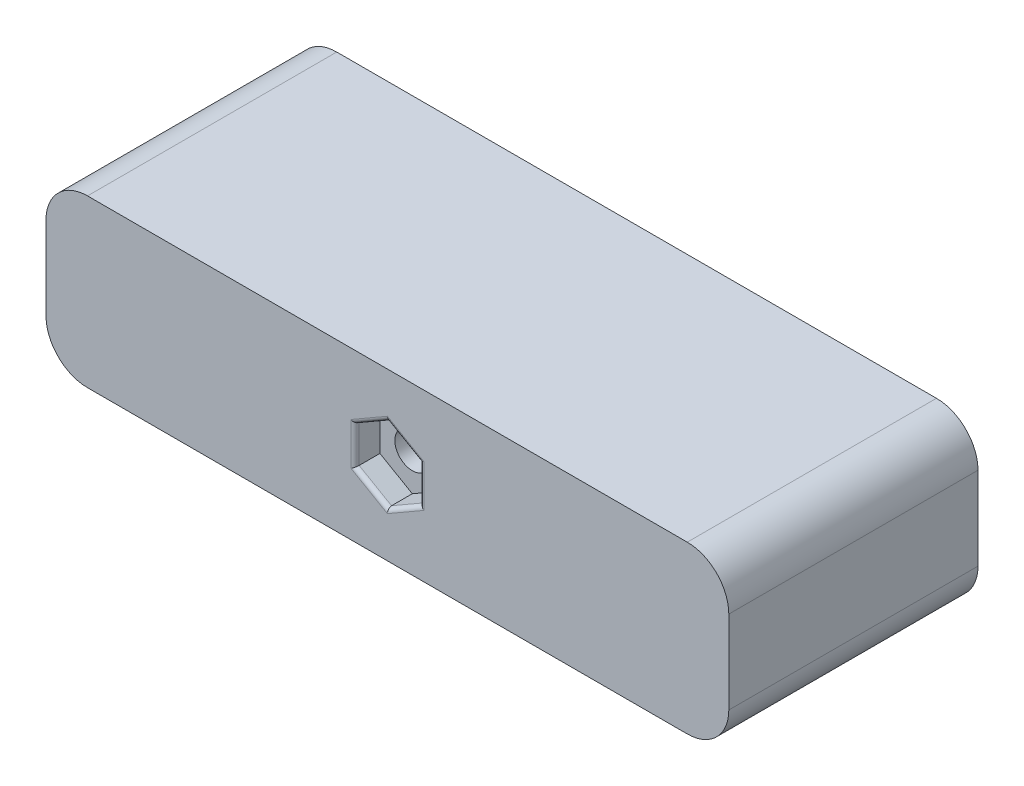
ISO-10303-21;
HEADER;
FILE_DESCRIPTION(('STEP AP214'),'2;1');
FILE_NAME('part.step','',(''),(''),'','','');
FILE_SCHEMA(('AUTOMOTIVE_DESIGN { 1 0 10303 214 1 1 1 1 }'));
ENDSEC;
DATA;
#1=APPLICATION_CONTEXT('core data for automotive mechanical design processes');
#2=APPLICATION_PROTOCOL_DEFINITION('international standard','automotive_design',2000,#1);
#3=PRODUCT_CONTEXT('',#1,'mechanical');
#4=PRODUCT('Part','Part','',(#3));
#5=PRODUCT_RELATED_PRODUCT_CATEGORY('part','',(#4));
#6=PRODUCT_DEFINITION_FORMATION('','',#4);
#7=PRODUCT_DEFINITION_CONTEXT('part definition',#1,'design');
#8=PRODUCT_DEFINITION('design','',#6,#7);
#9=PRODUCT_DEFINITION_SHAPE('','',#8);
#10=(LENGTH_UNIT() NAMED_UNIT(*) SI_UNIT(.MILLI.,.METRE.));
#11=(NAMED_UNIT(*) PLANE_ANGLE_UNIT() SI_UNIT($,.RADIAN.));
#12=(NAMED_UNIT(*) SI_UNIT($,.STERADIAN.) SOLID_ANGLE_UNIT());
#13=UNCERTAINTY_MEASURE_WITH_UNIT(LENGTH_MEASURE(1.E-05),#10,'distance_accuracy_value','');
#14=(GEOMETRIC_REPRESENTATION_CONTEXT(3) GLOBAL_UNCERTAINTY_ASSIGNED_CONTEXT((#13)) GLOBAL_UNIT_ASSIGNED_CONTEXT((#10,
#11,#12)) REPRESENTATION_CONTEXT('',''));
#15=CARTESIAN_POINT('',(0.,0.,0.));
#16=DIRECTION('',(0.,0.,1.));
#17=DIRECTION('',(1.,0.,0.));
#18=AXIS2_PLACEMENT_3D('',#15,#16,#17);
#19=CARTESIAN_POINT('',(0.,0.,0.));
#20=DIRECTION('',(0.,0.,1.));
#21=DIRECTION('',(1.,0.,0.));
#22=AXIS2_PLACEMENT_3D('',#19,#20,#21);
#23=PLANE('',#22);
#24=DIRECTION('',(1.,0.,0.));
#25=VECTOR('',#24,1.);
#26=CARTESIAN_POINT('',(0.,0.,0.));
#27=LINE('',#26,#25);
#28=CARTESIAN_POINT('',(-77.2,0.,0.));
#29=VERTEX_POINT('',#28);
#30=CARTESIAN_POINT('',(-5.,0.,0.));
#31=VERTEX_POINT('',#30);
#32=EDGE_CURVE('E208',#29,#31,#27,.T.);
#33=ORIENTED_EDGE('',*,*,#32,.F.);
#34=CARTESIAN_POINT('',(-77.2,4.99999999999999,0.));
#35=DIRECTION('',(0.,0.,1.));
#36=DIRECTION('',(1.,0.,0.));
#37=AXIS2_PLACEMENT_3D('',#34,#35,#36);
#38=CIRCLE('',#37,5.);
#39=CARTESIAN_POINT('',(-82.2,4.99999999999999,0.));
#40=VERTEX_POINT('',#39);
#41=EDGE_CURVE('E238',#29,#40,#38,.F.);
#42=ORIENTED_EDGE('',*,*,#41,.T.);
#43=DIRECTION('',(0.,-1.,0.));
#44=VECTOR('',#43,1.);
#45=CARTESIAN_POINT('',(-82.2,0.,0.));
#46=LINE('',#45,#44);
#47=CARTESIAN_POINT('',(-82.2,15.,0.));
#48=VERTEX_POINT('',#47);
#49=EDGE_CURVE('E223',#48,#40,#46,.T.);
#50=ORIENTED_EDGE('',*,*,#49,.F.);
#51=CARTESIAN_POINT('',(-77.2,15.,0.));
#52=DIRECTION('',(0.,0.,1.));
#53=DIRECTION('',(1.,0.,0.));
#54=AXIS2_PLACEMENT_3D('',#51,#52,#53);
#55=CIRCLE('',#54,5.);
#56=CARTESIAN_POINT('',(-77.2,20.,0.));
#57=VERTEX_POINT('',#56);
#58=EDGE_CURVE('E236',#48,#57,#55,.F.);
#59=ORIENTED_EDGE('',*,*,#58,.T.);
#60=DIRECTION('',(-1.,0.,0.));
#61=VECTOR('',#60,1.);
#62=CARTESIAN_POINT('',(0.,20.,0.));
#63=LINE('',#62,#61);
#64=CARTESIAN_POINT('',(-5.,20.,0.));
#65=VERTEX_POINT('',#64);
#66=EDGE_CURVE('E220',#65,#57,#63,.T.);
#67=ORIENTED_EDGE('',*,*,#66,.F.);
#68=CARTESIAN_POINT('',(-5.,15.,0.));
#69=DIRECTION('',(0.,0.,1.));
#70=DIRECTION('',(1.,0.,0.));
#71=AXIS2_PLACEMENT_3D('',#68,#69,#70);
#72=CIRCLE('',#71,5.);
#73=CARTESIAN_POINT('',(0.,15.,0.));
#74=VERTEX_POINT('',#73);
#75=EDGE_CURVE('E232',#65,#74,#72,.F.);
#76=ORIENTED_EDGE('',*,*,#75,.T.);
#77=DIRECTION('',(0.,1.,0.));
#78=VECTOR('',#77,1.);
#79=CARTESIAN_POINT('',(0.,0.,0.));
#80=LINE('',#79,#78);
#81=CARTESIAN_POINT('',(0.,5.,0.));
#82=VERTEX_POINT('',#81);
#83=EDGE_CURVE('E195',#82,#74,#80,.T.);
#84=ORIENTED_EDGE('',*,*,#83,.F.);
#85=CARTESIAN_POINT('',(-5.,5.,0.));
#86=DIRECTION('',(0.,0.,1.));
#87=DIRECTION('',(1.,0.,0.));
#88=AXIS2_PLACEMENT_3D('',#85,#86,#87);
#89=CIRCLE('',#88,5.);
#90=EDGE_CURVE('E234',#82,#31,#89,.F.);
#91=ORIENTED_EDGE('',*,*,#90,.T.);
#92=EDGE_LOOP('',(#33,#42,#50,#59,#67,#76,#84,#91));
#93=FACE_BOUND('',#92,.T.);
#94=CARTESIAN_POINT('',(-41.1,10.,0.));
#95=DIRECTION('',(0.,0.,1.));
#96=DIRECTION('',(1.,0.,0.));
#97=AXIS2_PLACEMENT_3D('',#94,#95,#96);
#98=CIRCLE('',#97,2.10377415285356);
#99=CARTESIAN_POINT('',(-38.9962258471465,10.,0.));
#100=VERTEX_POINT('',#99);
#101=EDGE_CURVE('E184',#100,#100,#98,.T.);
#102=ORIENTED_EDGE('',*,*,#101,.T.);
#103=EDGE_LOOP('',(#102));
#104=FACE_BOUND('',#103,.T.);
#105=ADVANCED_FACE('F33',(#93,#104),#23,.F.);
#106=CARTESIAN_POINT('',(0.,0.,27.));
#107=DIRECTION('',(0.,0.,1.));
#108=DIRECTION('',(1.,0.,0.));
#109=AXIS2_PLACEMENT_3D('',#106,#107,#108);
#110=PLANE('',#109);
#111=DIRECTION('',(0.866025403784439,-0.5,0.));
#112=VECTOR('',#111,1.);
#113=CARTESIAN_POINT('',(-45.,7.74833395016046,27.));
#114=LINE('',#113,#112);
#115=CARTESIAN_POINT('',(-45.,7.74833395016046,27.));
#116=VERTEX_POINT('',#115);
#117=CARTESIAN_POINT('',(-41.1,5.49666790032092,27.));
#118=VERTEX_POINT('',#117);
#119=EDGE_CURVE('E158',#116,#118,#114,.T.);
#120=ORIENTED_EDGE('',*,*,#119,.T.);
#121=DIRECTION('',(0.866025403784439,0.5,0.));
#122=VECTOR('',#121,1.);
#123=CARTESIAN_POINT('',(-41.1,5.49666790032092,27.));
#124=LINE('',#123,#122);
#125=CARTESIAN_POINT('',(-37.2,7.74833395016046,27.));
#126=VERTEX_POINT('',#125);
#127=EDGE_CURVE('E168',#118,#126,#124,.T.);
#128=ORIENTED_EDGE('',*,*,#127,.T.);
#129=DIRECTION('',(0.,1.,0.));
#130=VECTOR('',#129,1.);
#131=CARTESIAN_POINT('',(-37.2,7.74833395016046,27.));
#132=LINE('',#131,#130);
#133=CARTESIAN_POINT('',(-37.2,12.2516660498395,27.));
#134=VERTEX_POINT('',#133);
#135=EDGE_CURVE('E173',#126,#134,#132,.T.);
#136=ORIENTED_EDGE('',*,*,#135,.T.);
#137=DIRECTION('',(-0.866025403784439,0.5,0.));
#138=VECTOR('',#137,1.);
#139=CARTESIAN_POINT('',(-37.2,12.2516660498395,27.));
#140=LINE('',#139,#138);
#141=CARTESIAN_POINT('',(-41.1,14.5033320996791,27.));
#142=VERTEX_POINT('',#141);
#143=EDGE_CURVE('E187',#134,#142,#140,.T.);
#144=ORIENTED_EDGE('',*,*,#143,.T.);
#145=DIRECTION('',(-0.866025403784438,-0.5,0.));
#146=VECTOR('',#145,1.);
#147=CARTESIAN_POINT('',(-41.1,14.5033320996791,27.));
#148=LINE('',#147,#146);
#149=CARTESIAN_POINT('',(-45.,12.2516660498395,27.));
#150=VERTEX_POINT('',#149);
#151=EDGE_CURVE('E190',#142,#150,#148,.T.);
#152=ORIENTED_EDGE('',*,*,#151,.T.);
#153=DIRECTION('',(0.,-1.,0.));
#154=VECTOR('',#153,1.);
#155=CARTESIAN_POINT('',(-45.,12.2516660498395,27.));
#156=LINE('',#155,#154);
#157=EDGE_CURVE('E165',#150,#116,#156,.T.);
#158=ORIENTED_EDGE('',*,*,#157,.T.);
#159=EDGE_LOOP('',(#120,#128,#136,#144,#152,#158));
#160=FACE_BOUND('',#159,.T.);
#161=CARTESIAN_POINT('',(-41.1,10.,27.));
#162=DIRECTION('',(0.,0.,1.));
#163=DIRECTION('',(1.,0.,0.));
#164=AXIS2_PLACEMENT_3D('',#161,#162,#163);
#165=CIRCLE('',#164,2.10377415285356);
#166=CARTESIAN_POINT('',(-38.9962258471465,10.,27.));
#167=VERTEX_POINT('',#166);
#168=EDGE_CURVE('E37',#167,#167,#165,.F.);
#169=ORIENTED_EDGE('',*,*,#168,.T.);
#170=EDGE_LOOP('',(#169));
#171=FACE_BOUND('',#170,.T.);
#172=ADVANCED_FACE('F175',(#160,#171),#110,.T.);
#173=CARTESIAN_POINT('',(0.,0.,30.));
#174=DIRECTION('',(-1.,0.,0.));
#175=DIRECTION('',(0.,-1.,0.));
#176=AXIS2_PLACEMENT_3D('',#173,#174,#175);
#177=PLANE('',#176);
#178=DIRECTION('',(0.,1.,0.));
#179=VECTOR('',#178,1.);
#180=CARTESIAN_POINT('',(0.,0.,30.));
#181=LINE('',#180,#179);
#182=CARTESIAN_POINT('',(0.,5.,30.));
#183=VERTEX_POINT('',#182);
#184=CARTESIAN_POINT('',(0.,15.,30.));
#185=VERTEX_POINT('',#184);
#186=EDGE_CURVE('E204',#183,#185,#181,.T.);
#187=ORIENTED_EDGE('',*,*,#186,.F.);
#188=DIRECTION('',(0.,0.,-1.));
#189=VECTOR('',#188,1.);
#190=CARTESIAN_POINT('',(0.,5.,30.));
#191=LINE('',#190,#189);
#192=EDGE_CURVE('E260',#183,#82,#191,.T.);
#193=ORIENTED_EDGE('',*,*,#192,.T.);
#194=ORIENTED_EDGE('',*,*,#83,.T.);
#195=DIRECTION('',(0.,0.,-1.));
#196=VECTOR('',#195,1.);
#197=CARTESIAN_POINT('',(0.,15.,30.));
#198=LINE('',#197,#196);
#199=EDGE_CURVE('E258',#74,#185,#198,.F.);
#200=ORIENTED_EDGE('',*,*,#199,.T.);
#201=EDGE_LOOP('',(#187,#193,#194,#200));
#202=FACE_BOUND('',#201,.T.);
#203=ADVANCED_FACE('F354',(#202),#177,.F.);
#204=CARTESIAN_POINT('',(0.,20.,30.));
#205=DIRECTION('',(0.,-1.,0.));
#206=DIRECTION('',(1.,0.,0.));
#207=AXIS2_PLACEMENT_3D('',#204,#205,#206);
#208=PLANE('',#207);
#209=ORIENTED_EDGE('',*,*,#66,.T.);
#210=DIRECTION('',(0.,0.,-1.));
#211=VECTOR('',#210,1.);
#212=CARTESIAN_POINT('',(-77.2,20.,30.));
#213=LINE('',#212,#211);
#214=CARTESIAN_POINT('',(-77.2,20.,30.));
#215=VERTEX_POINT('',#214);
#216=EDGE_CURVE('E256',#57,#215,#213,.F.);
#217=ORIENTED_EDGE('',*,*,#216,.T.);
#218=DIRECTION('',(-1.,0.,0.));
#219=VECTOR('',#218,1.);
#220=CARTESIAN_POINT('',(0.,20.,30.));
#221=LINE('',#220,#219);
#222=CARTESIAN_POINT('',(-5.,20.,30.));
#223=VERTEX_POINT('',#222);
#224=EDGE_CURVE('E207',#223,#215,#221,.T.);
#225=ORIENTED_EDGE('',*,*,#224,.F.);
#226=DIRECTION('',(0.,0.,-1.));
#227=VECTOR('',#226,1.);
#228=CARTESIAN_POINT('',(-5.,20.,30.));
#229=LINE('',#228,#227);
#230=EDGE_CURVE('E253',#223,#65,#229,.T.);
#231=ORIENTED_EDGE('',*,*,#230,.T.);
#232=EDGE_LOOP('',(#209,#217,#225,#231));
#233=FACE_BOUND('',#232,.T.);
#234=ADVANCED_FACE('F363',(#233),#208,.F.);
#235=CARTESIAN_POINT('',(-82.2,0.,30.));
#236=DIRECTION('',(1.,0.,0.));
#237=DIRECTION('',(0.,0.,-1.));
#238=AXIS2_PLACEMENT_3D('',#235,#236,#237);
#239=PLANE('',#238);
#240=ORIENTED_EDGE('',*,*,#49,.T.);
#241=DIRECTION('',(0.,0.,-1.));
#242=VECTOR('',#241,1.);
#243=CARTESIAN_POINT('',(-82.2,4.99999999999999,30.));
#244=LINE('',#243,#242);
#245=CARTESIAN_POINT('',(-82.2,4.99999999999999,30.));
#246=VERTEX_POINT('',#245);
#247=EDGE_CURVE('E243',#40,#246,#244,.F.);
#248=ORIENTED_EDGE('',*,*,#247,.T.);
#249=DIRECTION('',(0.,-1.,0.));
#250=VECTOR('',#249,1.);
#251=CARTESIAN_POINT('',(-82.2,0.,30.));
#252=LINE('',#251,#250);
#253=CARTESIAN_POINT('',(-82.2,15.,30.));
#254=VERTEX_POINT('',#253);
#255=EDGE_CURVE('E211',#254,#246,#252,.T.);
#256=ORIENTED_EDGE('',*,*,#255,.F.);
#257=DIRECTION('',(0.,0.,-1.));
#258=VECTOR('',#257,1.);
#259=CARTESIAN_POINT('',(-82.2,15.,30.));
#260=LINE('',#259,#258);
#261=EDGE_CURVE('E240',#254,#48,#260,.T.);
#262=ORIENTED_EDGE('',*,*,#261,.T.);
#263=EDGE_LOOP('',(#240,#248,#256,#262));
#264=FACE_BOUND('',#263,.T.);
#265=ADVANCED_FACE('F367',(#264),#239,.F.);
#266=CARTESIAN_POINT('',(0.,0.,30.));
#267=DIRECTION('',(0.,1.,0.));
#268=DIRECTION('',(-1.,0.,0.));
#269=AXIS2_PLACEMENT_3D('',#266,#267,#268);
#270=PLANE('',#269);
#271=DIRECTION('',(1.,0.,0.));
#272=VECTOR('',#271,1.);
#273=CARTESIAN_POINT('',(0.,0.,30.));
#274=LINE('',#273,#272);
#275=CARTESIAN_POINT('',(-77.2,0.,30.));
#276=VERTEX_POINT('',#275);
#277=CARTESIAN_POINT('',(-5.,0.,30.));
#278=VERTEX_POINT('',#277);
#279=EDGE_CURVE('E214',#276,#278,#274,.T.);
#280=ORIENTED_EDGE('',*,*,#279,.F.);
#281=DIRECTION('',(0.,0.,-1.));
#282=VECTOR('',#281,1.);
#283=CARTESIAN_POINT('',(-77.2,0.,30.));
#284=LINE('',#283,#282);
#285=EDGE_CURVE('E229',#276,#29,#284,.T.);
#286=ORIENTED_EDGE('',*,*,#285,.T.);
#287=ORIENTED_EDGE('',*,*,#32,.T.);
#288=DIRECTION('',(0.,0.,-1.));
#289=VECTOR('',#288,1.);
#290=CARTESIAN_POINT('',(-5.,0.,30.));
#291=LINE('',#290,#289);
#292=EDGE_CURVE('E217',#31,#278,#291,.F.);
#293=ORIENTED_EDGE('',*,*,#292,.T.);
#294=EDGE_LOOP('',(#280,#286,#287,#293));
#295=FACE_BOUND('',#294,.T.);
#296=ADVANCED_FACE('F329',(#295),#270,.F.);
#297=CARTESIAN_POINT('',(0.,0.,30.));
#298=DIRECTION('',(0.,0.,1.));
#299=DIRECTION('',(1.,0.,0.));
#300=AXIS2_PLACEMENT_3D('',#297,#298,#299);
#301=PLANE('',#300);
#302=DIRECTION('',(0.866025403784439,-0.5,0.));
#303=VECTOR('',#302,1.);
#304=CARTESIAN_POINT('',(-45.25,7.31532124826824,30.));
#305=LINE('',#304,#303);
#306=CARTESIAN_POINT('',(-41.1,4.9193176311313,30.));
#307=VERTEX_POINT('',#306);
#308=CARTESIAN_POINT('',(-45.5,7.45965881556565,30.));
#309=VERTEX_POINT('',#308);
#310=EDGE_CURVE('E274',#307,#309,#305,.F.);
#311=ORIENTED_EDGE('',*,*,#310,.T.);
#312=DIRECTION('',(0.,-1.,0.));
#313=VECTOR('',#312,1.);
#314=CARTESIAN_POINT('',(-45.5,12.2516660498395,30.));
#315=LINE('',#314,#313);
#316=CARTESIAN_POINT('',(-45.5,12.5403411844343,30.));
#317=VERTEX_POINT('',#316);
#318=EDGE_CURVE('E276',#309,#317,#315,.F.);
#319=ORIENTED_EDGE('',*,*,#318,.T.);
#320=DIRECTION('',(-0.866025403784439,-0.5,0.));
#321=VECTOR('',#320,1.);
#322=CARTESIAN_POINT('',(-41.35,14.9363448015713,30.));
#323=LINE('',#322,#321);
#324=CARTESIAN_POINT('',(-41.1,15.0806823688687,30.));
#325=VERTEX_POINT('',#324);
#326=EDGE_CURVE('E266',#317,#325,#323,.F.);
#327=ORIENTED_EDGE('',*,*,#326,.T.);
#328=DIRECTION('',(-0.866025403784439,0.5,0.));
#329=VECTOR('',#328,1.);
#330=CARTESIAN_POINT('',(-36.95,12.6846787517318,30.));
#331=LINE('',#330,#329);
#332=CARTESIAN_POINT('',(-36.7,12.5403411844343,30.));
#333=VERTEX_POINT('',#332);
#334=EDGE_CURVE('E268',#325,#333,#331,.F.);
#335=ORIENTED_EDGE('',*,*,#334,.T.);
#336=DIRECTION('',(0.,1.,0.));
#337=VECTOR('',#336,1.);
#338=CARTESIAN_POINT('',(-36.7,7.74833395016046,30.));
#339=LINE('',#338,#337);
#340=CARTESIAN_POINT('',(-36.7,7.45965881556565,30.));
#341=VERTEX_POINT('',#340);
#342=EDGE_CURVE('E270',#333,#341,#339,.F.);
#343=ORIENTED_EDGE('',*,*,#342,.T.);
#344=DIRECTION('',(0.866025403784439,0.5,0.));
#345=VECTOR('',#344,1.);
#346=CARTESIAN_POINT('',(-40.85,5.06365519842871,30.));
#347=LINE('',#346,#345);
#348=EDGE_CURVE('E272',#341,#307,#347,.F.);
#349=ORIENTED_EDGE('',*,*,#348,.T.);
#350=EDGE_LOOP('',(#311,#319,#327,#335,#343,#349));
#351=FACE_BOUND('',#350,.T.);
#352=ORIENTED_EDGE('',*,*,#255,.T.);
#353=CARTESIAN_POINT('',(-77.2,4.99999999999999,30.));
#354=DIRECTION('',(0.,0.,1.));
#355=DIRECTION('',(1.,0.,0.));
#356=AXIS2_PLACEMENT_3D('',#353,#354,#355);
#357=CIRCLE('',#356,5.);
#358=EDGE_CURVE('E251',#246,#276,#357,.T.);
#359=ORIENTED_EDGE('',*,*,#358,.T.);
#360=ORIENTED_EDGE('',*,*,#279,.T.);
#361=CARTESIAN_POINT('',(-5.,5.,30.));
#362=DIRECTION('',(0.,0.,1.));
#363=DIRECTION('',(1.,0.,0.));
#364=AXIS2_PLACEMENT_3D('',#361,#362,#363);
#365=CIRCLE('',#364,5.);
#366=EDGE_CURVE('E247',#278,#183,#365,.T.);
#367=ORIENTED_EDGE('',*,*,#366,.T.);
#368=ORIENTED_EDGE('',*,*,#186,.T.);
#369=CARTESIAN_POINT('',(-5.,15.,30.));
#370=DIRECTION('',(0.,0.,1.));
#371=DIRECTION('',(1.,0.,0.));
#372=AXIS2_PLACEMENT_3D('',#369,#370,#371);
#373=CIRCLE('',#372,5.);
#374=EDGE_CURVE('E245',#185,#223,#373,.T.);
#375=ORIENTED_EDGE('',*,*,#374,.T.);
#376=ORIENTED_EDGE('',*,*,#224,.T.);
#377=CARTESIAN_POINT('',(-77.2,15.,30.));
#378=DIRECTION('',(0.,0.,1.));
#379=DIRECTION('',(1.,0.,0.));
#380=AXIS2_PLACEMENT_3D('',#377,#378,#379);
#381=CIRCLE('',#380,5.);
#382=EDGE_CURVE('E249',#215,#254,#381,.T.);
#383=ORIENTED_EDGE('',*,*,#382,.T.);
#384=EDGE_LOOP('',(#352,#359,#360,#367,#368,#375,#376,#383));
#385=FACE_BOUND('',#384,.T.);
#386=ADVANCED_FACE('F326',(#351,#385),#301,.T.);
#387=CARTESIAN_POINT('',(-45.,7.74833395016046,27.));
#388=DIRECTION('',(-0.5,-0.866025403784439,0.));
#389=DIRECTION('',(0.866025403784439,-0.5,0.));
#390=AXIS2_PLACEMENT_3D('',#387,#388,#389);
#391=PLANE('',#390);
#392=DIRECTION('',(0.,0.,1.));
#393=VECTOR('',#392,1.);
#394=CARTESIAN_POINT('',(-45.,7.74833395016046,27.));
#395=LINE('',#394,#393);
#396=CARTESIAN_POINT('',(-45.,7.74833395016046,29.5));
#397=VERTEX_POINT('',#396);
#398=EDGE_CURVE('E193',#116,#397,#395,.T.);
#399=ORIENTED_EDGE('',*,*,#398,.T.);
#400=DIRECTION('',(0.866025403784439,-0.5,0.));
#401=VECTOR('',#400,1.);
#402=CARTESIAN_POINT('',(-41.1,5.49666790032092,29.5));
#403=LINE('',#402,#401);
#404=CARTESIAN_POINT('',(-41.1,5.49666790032092,29.5));
#405=VERTEX_POINT('',#404);
#406=EDGE_CURVE('E161',#397,#405,#403,.T.);
#407=ORIENTED_EDGE('',*,*,#406,.T.);
#408=DIRECTION('',(0.,0.,1.));
#409=VECTOR('',#408,1.);
#410=CARTESIAN_POINT('',(-41.1,5.49666790032092,27.));
#411=LINE('',#410,#409);
#412=EDGE_CURVE('E153',#118,#405,#411,.T.);
#413=ORIENTED_EDGE('',*,*,#412,.F.);
#414=ORIENTED_EDGE('',*,*,#119,.F.);
#415=EDGE_LOOP('',(#399,#407,#413,#414));
#416=FACE_BOUND('',#415,.T.);
#417=ADVANCED_FACE('F156',(#416),#391,.F.);
#418=CARTESIAN_POINT('',(-45.,12.2516660498395,27.));
#419=DIRECTION('',(-1.,0.,0.));
#420=DIRECTION('',(0.,0.,1.));
#421=AXIS2_PLACEMENT_3D('',#418,#419,#420);
#422=PLANE('',#421);
#423=DIRECTION('',(0.,0.,1.));
#424=VECTOR('',#423,1.);
#425=CARTESIAN_POINT('',(-45.,12.2516660498395,27.));
#426=LINE('',#425,#424);
#427=CARTESIAN_POINT('',(-45.,12.2516660498395,29.5));
#428=VERTEX_POINT('',#427);
#429=EDGE_CURVE('E196',#150,#428,#426,.T.);
#430=ORIENTED_EDGE('',*,*,#429,.T.);
#431=DIRECTION('',(0.,-1.,0.));
#432=VECTOR('',#431,1.);
#433=CARTESIAN_POINT('',(-45.,7.74833395016046,29.5));
#434=LINE('',#433,#432);
#435=EDGE_CURVE('E263',#428,#397,#434,.T.);
#436=ORIENTED_EDGE('',*,*,#435,.T.);
#437=ORIENTED_EDGE('',*,*,#398,.F.);
#438=ORIENTED_EDGE('',*,*,#157,.F.);
#439=EDGE_LOOP('',(#430,#436,#437,#438));
#440=FACE_BOUND('',#439,.T.);
#441=ADVANCED_FACE('F317',(#440),#422,.F.);
#442=CARTESIAN_POINT('',(-41.1,14.5033320996791,27.));
#443=DIRECTION('',(-0.5,0.866025403784439,0.));
#444=DIRECTION('',(-0.866025403784439,-0.5,0.));
#445=AXIS2_PLACEMENT_3D('',#442,#443,#444);
#446=PLANE('',#445);
#447=DIRECTION('',(0.,0.,1.));
#448=VECTOR('',#447,1.);
#449=CARTESIAN_POINT('',(-41.1,14.5033320996791,27.));
#450=LINE('',#449,#448);
#451=CARTESIAN_POINT('',(-41.1,14.5033320996791,29.5));
#452=VERTEX_POINT('',#451);
#453=EDGE_CURVE('E199',#142,#452,#450,.T.);
#454=ORIENTED_EDGE('',*,*,#453,.T.);
#455=DIRECTION('',(-0.866025403784439,-0.5,0.));
#456=VECTOR('',#455,1.);
#457=CARTESIAN_POINT('',(-45.,12.2516660498395,29.5));
#458=LINE('',#457,#456);
#459=EDGE_CURVE('E11',#452,#428,#458,.T.);
#460=ORIENTED_EDGE('',*,*,#459,.T.);
#461=ORIENTED_EDGE('',*,*,#429,.F.);
#462=ORIENTED_EDGE('',*,*,#151,.F.);
#463=EDGE_LOOP('',(#454,#460,#461,#462));
#464=FACE_BOUND('',#463,.T.);
#465=ADVANCED_FACE('F314',(#464),#446,.F.);
#466=CARTESIAN_POINT('',(-37.2,12.2516660498395,27.));
#467=DIRECTION('',(0.5,0.866025403784439,0.));
#468=DIRECTION('',(-0.866025403784439,0.5,0.));
#469=AXIS2_PLACEMENT_3D('',#466,#467,#468);
#470=PLANE('',#469);
#471=DIRECTION('',(0.,0.,1.));
#472=VECTOR('',#471,1.);
#473=CARTESIAN_POINT('',(-37.2,12.2516660498395,27.));
#474=LINE('',#473,#472);
#475=CARTESIAN_POINT('',(-37.2,12.2516660498395,29.5));
#476=VERTEX_POINT('',#475);
#477=EDGE_CURVE('E201',#134,#476,#474,.T.);
#478=ORIENTED_EDGE('',*,*,#477,.T.);
#479=DIRECTION('',(-0.866025403784439,0.5,0.));
#480=VECTOR('',#479,1.);
#481=CARTESIAN_POINT('',(-41.1,14.5033320996791,29.5));
#482=LINE('',#481,#480);
#483=EDGE_CURVE('E42',#476,#452,#482,.T.);
#484=ORIENTED_EDGE('',*,*,#483,.T.);
#485=ORIENTED_EDGE('',*,*,#453,.F.);
#486=ORIENTED_EDGE('',*,*,#143,.F.);
#487=EDGE_LOOP('',(#478,#484,#485,#486));
#488=FACE_BOUND('',#487,.T.);
#489=ADVANCED_FACE('F390',(#488),#470,.F.);
#490=CARTESIAN_POINT('',(-37.2,7.74833395016046,27.));
#491=DIRECTION('',(1.,0.,0.));
#492=DIRECTION('',(0.,0.,-1.));
#493=AXIS2_PLACEMENT_3D('',#490,#491,#492);
#494=PLANE('',#493);
#495=DIRECTION('',(0.,0.,1.));
#496=VECTOR('',#495,1.);
#497=CARTESIAN_POINT('',(-37.2,7.74833395016046,27.));
#498=LINE('',#497,#496);
#499=CARTESIAN_POINT('',(-37.2,7.74833395016046,29.5));
#500=VERTEX_POINT('',#499);
#501=EDGE_CURVE('E164',#126,#500,#498,.T.);
#502=ORIENTED_EDGE('',*,*,#501,.T.);
#503=DIRECTION('',(0.,1.,0.));
#504=VECTOR('',#503,1.);
#505=CARTESIAN_POINT('',(-37.2,12.2516660498395,29.5));
#506=LINE('',#505,#504);
#507=EDGE_CURVE('E57',#500,#476,#506,.T.);
#508=ORIENTED_EDGE('',*,*,#507,.T.);
#509=ORIENTED_EDGE('',*,*,#477,.F.);
#510=ORIENTED_EDGE('',*,*,#135,.F.);
#511=EDGE_LOOP('',(#502,#508,#509,#510));
#512=FACE_BOUND('',#511,.T.);
#513=ADVANCED_FACE('F387',(#512),#494,.F.);
#514=CARTESIAN_POINT('',(-41.1,5.49666790032092,27.));
#515=DIRECTION('',(0.5,-0.866025403784438,0.));
#516=DIRECTION('',(0.866025403784439,0.5,0.));
#517=AXIS2_PLACEMENT_3D('',#514,#515,#516);
#518=PLANE('',#517);
#519=ORIENTED_EDGE('',*,*,#412,.T.);
#520=DIRECTION('',(0.866025403784439,0.5,0.));
#521=VECTOR('',#520,1.);
#522=CARTESIAN_POINT('',(-37.2,7.74833395016046,29.5));
#523=LINE('',#522,#521);
#524=EDGE_CURVE('E280',#405,#500,#523,.T.);
#525=ORIENTED_EDGE('',*,*,#524,.T.);
#526=ORIENTED_EDGE('',*,*,#501,.F.);
#527=ORIENTED_EDGE('',*,*,#127,.F.);
#528=EDGE_LOOP('',(#519,#525,#526,#527));
#529=FACE_BOUND('',#528,.T.);
#530=ADVANCED_FACE('F169',(#529),#518,.F.);
#531=CARTESIAN_POINT('',(-77.2,4.99999999999999,30.));
#532=DIRECTION('',(0.,0.,-1.));
#533=DIRECTION('',(-1.,0.,0.));
#534=AXIS2_PLACEMENT_3D('',#531,#532,#533);
#535=CYLINDRICAL_SURFACE('',#534,5.);
#536=ORIENTED_EDGE('',*,*,#358,.F.);
#537=ORIENTED_EDGE('',*,*,#247,.F.);
#538=ORIENTED_EDGE('',*,*,#41,.F.);
#539=ORIENTED_EDGE('',*,*,#285,.F.);
#540=EDGE_LOOP('',(#536,#537,#538,#539));
#541=FACE_BOUND('',#540,.T.);
#542=ADVANCED_FACE('F340',(#541),#535,.T.);
#543=CARTESIAN_POINT('',(-77.2,15.,30.));
#544=DIRECTION('',(0.,0.,-1.));
#545=DIRECTION('',(-1.,0.,0.));
#546=AXIS2_PLACEMENT_3D('',#543,#544,#545);
#547=CYLINDRICAL_SURFACE('',#546,5.);
#548=ORIENTED_EDGE('',*,*,#382,.F.);
#549=ORIENTED_EDGE('',*,*,#216,.F.);
#550=ORIENTED_EDGE('',*,*,#58,.F.);
#551=ORIENTED_EDGE('',*,*,#261,.F.);
#552=EDGE_LOOP('',(#548,#549,#550,#551));
#553=FACE_BOUND('',#552,.T.);
#554=ADVANCED_FACE('F366',(#553),#547,.T.);
#555=CARTESIAN_POINT('',(-5.,5.,30.));
#556=DIRECTION('',(0.,0.,-1.));
#557=DIRECTION('',(-1.,0.,0.));
#558=AXIS2_PLACEMENT_3D('',#555,#556,#557);
#559=CYLINDRICAL_SURFACE('',#558,5.);
#560=ORIENTED_EDGE('',*,*,#366,.F.);
#561=ORIENTED_EDGE('',*,*,#292,.F.);
#562=ORIENTED_EDGE('',*,*,#90,.F.);
#563=ORIENTED_EDGE('',*,*,#192,.F.);
#564=EDGE_LOOP('',(#560,#561,#562,#563));
#565=FACE_BOUND('',#564,.T.);
#566=ADVANCED_FACE('F351',(#565),#559,.T.);
#567=CARTESIAN_POINT('',(-5.,15.,30.));
#568=DIRECTION('',(0.,0.,-1.));
#569=DIRECTION('',(-1.,0.,0.));
#570=AXIS2_PLACEMENT_3D('',#567,#568,#569);
#571=CYLINDRICAL_SURFACE('',#570,5.);
#572=ORIENTED_EDGE('',*,*,#374,.F.);
#573=ORIENTED_EDGE('',*,*,#199,.F.);
#574=ORIENTED_EDGE('',*,*,#75,.F.);
#575=ORIENTED_EDGE('',*,*,#230,.F.);
#576=EDGE_LOOP('',(#572,#573,#574,#575));
#577=FACE_BOUND('',#576,.T.);
#578=ADVANCED_FACE('F360',(#577),#571,.T.);
#579=CARTESIAN_POINT('',(-36.7,7.74833395016046,29.5));
#580=DIRECTION('',(0.,-1.,0.));
#581=DIRECTION('',(0.,0.,-1.));
#582=AXIS2_PLACEMENT_3D('',#579,#580,#581);
#583=CYLINDRICAL_SURFACE('',#582,0.5);
#584=CARTESIAN_POINT('',(-36.7,7.45965881556565,29.5));
#585=DIRECTION('',(-0.5,-0.866025403784439,0.));
#586=DIRECTION('',(-0.866025403784439,0.5,0.));
#587=AXIS2_PLACEMENT_3D('',#584,#585,#586);
#588=ELLIPSE('',#587,0.577350269189626,0.5);
#589=EDGE_CURVE('E182',#341,#500,#588,.T.);
#590=ORIENTED_EDGE('',*,*,#589,.F.);
#591=ORIENTED_EDGE('',*,*,#342,.F.);
#592=CARTESIAN_POINT('',(-36.7,12.5403411844343,29.5));
#593=DIRECTION('',(0.5,-0.866025403784439,0.));
#594=DIRECTION('',(-0.866025403784439,-0.5,0.));
#595=AXIS2_PLACEMENT_3D('',#592,#593,#594);
#596=ELLIPSE('',#595,0.577350269189626,0.5);
#597=EDGE_CURVE('E179',#476,#333,#596,.F.);
#598=ORIENTED_EDGE('',*,*,#597,.F.);
#599=ORIENTED_EDGE('',*,*,#507,.F.);
#600=EDGE_LOOP('',(#590,#591,#598,#599));
#601=FACE_BOUND('',#600,.T.);
#602=ADVANCED_FACE('F35',(#601),#583,.T.);
#603=CARTESIAN_POINT('',(-36.95,12.6846787517318,29.5));
#604=DIRECTION('',(0.866025403784439,-0.5,0.));
#605=DIRECTION('',(0.5,0.866025403784439,0.));
#606=AXIS2_PLACEMENT_3D('',#603,#604,#605);
#607=CYLINDRICAL_SURFACE('',#606,0.5);
#608=ORIENTED_EDGE('',*,*,#597,.T.);
#609=ORIENTED_EDGE('',*,*,#334,.F.);
#610=CARTESIAN_POINT('',(-41.1,15.0806823688687,29.5));
#611=DIRECTION('',(1.,0.,0.));
#612=DIRECTION('',(0.,-1.,0.));
#613=AXIS2_PLACEMENT_3D('',#610,#611,#612);
#614=ELLIPSE('',#613,0.577350269189626,0.5);
#615=EDGE_CURVE('E291',#452,#325,#614,.F.);
#616=ORIENTED_EDGE('',*,*,#615,.F.);
#617=ORIENTED_EDGE('',*,*,#483,.F.);
#618=EDGE_LOOP('',(#608,#609,#616,#617));
#619=FACE_BOUND('',#618,.T.);
#620=ADVANCED_FACE('F306',(#619),#607,.T.);
#621=CARTESIAN_POINT('',(-40.85,5.06365519842871,29.5));
#622=DIRECTION('',(-0.866025403784439,-0.5,0.));
#623=DIRECTION('',(0.5,-0.866025403784439,0.));
#624=AXIS2_PLACEMENT_3D('',#621,#622,#623);
#625=CYLINDRICAL_SURFACE('',#624,0.5);
#626=ORIENTED_EDGE('',*,*,#589,.T.);
#627=ORIENTED_EDGE('',*,*,#524,.F.);
#628=CARTESIAN_POINT('',(-41.1,4.9193176311313,29.5));
#629=DIRECTION('',(-1.,0.,0.));
#630=DIRECTION('',(0.,1.,0.));
#631=AXIS2_PLACEMENT_3D('',#628,#629,#630);
#632=ELLIPSE('',#631,0.577350269189626,0.5);
#633=EDGE_CURVE('E288',#307,#405,#632,.T.);
#634=ORIENTED_EDGE('',*,*,#633,.F.);
#635=ORIENTED_EDGE('',*,*,#348,.F.);
#636=EDGE_LOOP('',(#626,#627,#634,#635));
#637=FACE_BOUND('',#636,.T.);
#638=ADVANCED_FACE('F298',(#637),#625,.T.);
#639=CARTESIAN_POINT('',(-41.35,14.9363448015713,29.5));
#640=DIRECTION('',(0.866025403784439,0.5,0.));
#641=DIRECTION('',(-0.5,0.866025403784439,0.));
#642=AXIS2_PLACEMENT_3D('',#639,#640,#641);
#643=CYLINDRICAL_SURFACE('',#642,0.5);
#644=ORIENTED_EDGE('',*,*,#615,.T.);
#645=ORIENTED_EDGE('',*,*,#326,.F.);
#646=CARTESIAN_POINT('',(-45.5,12.5403411844343,29.5));
#647=DIRECTION('',(0.5,0.866025403784439,0.));
#648=DIRECTION('',(-0.866025403784439,0.5,0.));
#649=AXIS2_PLACEMENT_3D('',#646,#647,#648);
#650=ELLIPSE('',#649,0.577350269189626,0.5);
#651=EDGE_CURVE('E286',#428,#317,#650,.F.);
#652=ORIENTED_EDGE('',*,*,#651,.F.);
#653=ORIENTED_EDGE('',*,*,#459,.F.);
#654=EDGE_LOOP('',(#644,#645,#652,#653));
#655=FACE_BOUND('',#654,.T.);
#656=ADVANCED_FACE('F311',(#655),#643,.T.);
#657=CARTESIAN_POINT('',(-45.25,7.31532124826824,29.5));
#658=DIRECTION('',(-0.866025403784439,0.5,0.));
#659=DIRECTION('',(-0.5,-0.866025403784439,0.));
#660=AXIS2_PLACEMENT_3D('',#657,#658,#659);
#661=CYLINDRICAL_SURFACE('',#660,0.5);
#662=ORIENTED_EDGE('',*,*,#633,.T.);
#663=ORIENTED_EDGE('',*,*,#406,.F.);
#664=CARTESIAN_POINT('',(-45.5,7.45965881556565,29.5));
#665=DIRECTION('',(-0.5,0.866025403784438,0.));
#666=DIRECTION('',(0.866025403784439,0.5,0.));
#667=AXIS2_PLACEMENT_3D('',#664,#665,#666);
#668=ELLIPSE('',#667,0.577350269189626,0.5);
#669=EDGE_CURVE('E284',#309,#397,#668,.T.);
#670=ORIENTED_EDGE('',*,*,#669,.F.);
#671=ORIENTED_EDGE('',*,*,#310,.F.);
#672=EDGE_LOOP('',(#662,#663,#670,#671));
#673=FACE_BOUND('',#672,.T.);
#674=ADVANCED_FACE('F324',(#673),#661,.T.);
#675=CARTESIAN_POINT('',(-45.5,12.2516660498395,29.5));
#676=DIRECTION('',(0.,1.,0.));
#677=DIRECTION('',(0.,0.,1.));
#678=AXIS2_PLACEMENT_3D('',#675,#676,#677);
#679=CYLINDRICAL_SURFACE('',#678,0.5);
#680=ORIENTED_EDGE('',*,*,#651,.T.);
#681=ORIENTED_EDGE('',*,*,#318,.F.);
#682=ORIENTED_EDGE('',*,*,#669,.T.);
#683=ORIENTED_EDGE('',*,*,#435,.F.);
#684=EDGE_LOOP('',(#680,#681,#682,#683));
#685=FACE_BOUND('',#684,.T.);
#686=ADVANCED_FACE('F319',(#685),#679,.T.);
#687=CARTESIAN_POINT('',(-41.1,10.,30.));
#688=DIRECTION('',(0.,0.,-1.));
#689=DIRECTION('',(-1.,0.,0.));
#690=AXIS2_PLACEMENT_3D('',#687,#688,#689);
#691=CYLINDRICAL_SURFACE('',#690,2.10377415285356);
#692=ORIENTED_EDGE('',*,*,#168,.F.);
#693=EDGE_LOOP('',(#692));
#694=FACE_BOUND('',#693,.T.);
#695=ORIENTED_EDGE('',*,*,#101,.F.);
#696=EDGE_LOOP('',(#695));
#697=FACE_BOUND('',#696,.T.);
#698=ADVANCED_FACE('F397',(#694,#697),#691,.F.);
#699=CLOSED_SHELL('',(#105,#172,#203,#234,#265,#296,#386,#417,#441,#465,#489,#513,#530,#542,
#554,#566,#578,#602,#620,#638,#656,#674,#686,#698));
#700=MANIFOLD_SOLID_BREP('B2',#699);
#701=ADVANCED_BREP_SHAPE_REPRESENTATION('',(#18,#700),#14);
#702=SHAPE_DEFINITION_REPRESENTATION(#9,#701);
ENDSEC;
END-ISO-10303-21;
